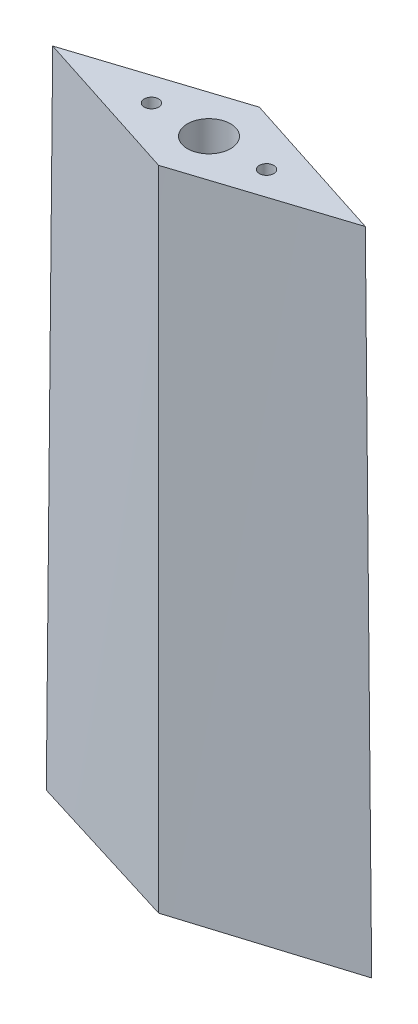
ISO-10303-21;
HEADER;
FILE_DESCRIPTION(('STEP AP214'),'2;1');
FILE_NAME('part.step','',(''),(''),'','','');
FILE_SCHEMA(('AUTOMOTIVE_DESIGN { 1 0 10303 214 1 1 1 1 }'));
ENDSEC;
DATA;
#1=APPLICATION_CONTEXT('core data for automotive mechanical design processes');
#2=APPLICATION_PROTOCOL_DEFINITION('international standard','automotive_design',2000,#1);
#3=PRODUCT_CONTEXT('',#1,'mechanical');
#4=PRODUCT('Part','Part','',(#3));
#5=PRODUCT_RELATED_PRODUCT_CATEGORY('part','',(#4));
#6=PRODUCT_DEFINITION_FORMATION('','',#4);
#7=PRODUCT_DEFINITION_CONTEXT('part definition',#1,'design');
#8=PRODUCT_DEFINITION('design','',#6,#7);
#9=PRODUCT_DEFINITION_SHAPE('','',#8);
#10=(LENGTH_UNIT() NAMED_UNIT(*) SI_UNIT(.MILLI.,.METRE.));
#11=(NAMED_UNIT(*) PLANE_ANGLE_UNIT() SI_UNIT($,.RADIAN.));
#12=(NAMED_UNIT(*) SI_UNIT($,.STERADIAN.) SOLID_ANGLE_UNIT());
#13=UNCERTAINTY_MEASURE_WITH_UNIT(LENGTH_MEASURE(1.E-05),#10,'distance_accuracy_value','');
#14=(GEOMETRIC_REPRESENTATION_CONTEXT(3) GLOBAL_UNCERTAINTY_ASSIGNED_CONTEXT((#13)) GLOBAL_UNIT_ASSIGNED_CONTEXT((#10,
#11,#12)) REPRESENTATION_CONTEXT('',''));
#15=CARTESIAN_POINT('',(0.,0.,0.));
#16=DIRECTION('',(0.,0.,1.));
#17=DIRECTION('',(1.,0.,0.));
#18=AXIS2_PLACEMENT_3D('',#15,#16,#17);
#19=CARTESIAN_POINT('',(219.716026671538,465.168027231046,0.));
#20=CARTESIAN_POINT('',(213.502471629307,1096.96763455169,0.));
#21=CARTESIAN_POINT('',(213.274793673085,465.168027231046,1.85208333333331));
#22=CARTESIAN_POINT('',(208.096831137892,1096.96763455169,1.85208333333331));
#23=CARTESIAN_POINT('',(206.833560674631,465.168027231046,3.70416666666664));
#24=CARTESIAN_POINT('',(202.691190646477,1096.96763455169,3.70416666666663));
#25=CARTESIAN_POINT('',(193.951094677724,465.168027231046,7.4083333333333));
#26=CARTESIAN_POINT('',(191.879909663647,1096.96763455169,7.4083333333333));
#27=CARTESIAN_POINT('',(187.509861679271,465.168027231046,9.26041666666665));
#28=CARTESIAN_POINT('',(186.474269172232,1096.96763455169,9.26041666666665));
#29=CARTESIAN_POINT('',(181.068628680817,465.168027231046,11.1125));
#30=CARTESIAN_POINT('',(181.068628680817,1096.96763455169,11.1125));
#31=B_SPLINE_SURFACE_WITH_KNOTS('',3,1,((#19,#20),(#21,#22),(#23,#24),(#25,#26),(#27,#28),(#29,
#30)),.UNSPECIFIED.,.F.,.F.,.F.,(4,2,4),(2,2),(0.,0.5,1.),(0.,1.),.UNSPECIFIED.);
#32=DIRECTION('',(0.,1.,0.));
#33=VECTOR('',#32,1.);
#34=CARTESIAN_POINT('',(181.068628680817,781.067830891368,11.1125));
#35=LINE('',#34,#33);
#36=CARTESIAN_POINT('',(181.068628680817,745.712215652406,11.1125));
#37=VERTEX_POINT('',#36);
#38=CARTESIAN_POINT('',(181.068628680817,888.587215652406,11.1125));
#39=VERTEX_POINT('',#38);
#40=EDGE_CURVE('E68',#37,#39,#35,.T.);
#41=CARTESIAN_POINT('',(181.068628680817,745.712215652406,11.1125));
#42=CARTESIAN_POINT('',(184.269788718265,745.712215652406,10.1212895187487));
#43=CARTESIAN_POINT('',(187.470948755713,745.712215652406,9.13007903749738));
#44=CARTESIAN_POINT('',(193.873268830608,745.712215652406,7.14765807499477));
#45=CARTESIAN_POINT('',(197.074428868056,745.712215652406,6.15644759374346));
#46=CARTESIAN_POINT('',(205.836046191891,745.712215652406,3.44349140832811));
#47=CARTESIAN_POINT('',(211.396503478278,745.712215652406,1.72174570416407));
#48=CARTESIAN_POINT('',(216.956960764665,745.712215652406,0.));
#49=B_SPLINE_CURVE_WITH_KNOTS('',3,(#41,#42,#43,#44,#45,#46,#47,#48),.UNSPECIFIED.,.F.,.F.,(4,2,
2,4),(0.,10.0533235415682,20.1066470831364,37.5694029232634),.UNSPECIFIED.);
#50=CARTESIAN_POINT('',(216.956960764665,745.712215652406,0.));
#51=VERTEX_POINT('',#50);
#52=EDGE_CURVE('E142',#37,#51,#49,.T.);
#53=DIRECTION('',(-0.00983421721197636,0.99995164291671,0.));
#54=VECTOR('',#53,1.);
#55=CARTESIAN_POINT('',(219.716026671538,465.168027231046,0.));
#56=LINE('',#55,#54);
#57=CARTESIAN_POINT('',(215.551829032432,888.587215652406,0.));
#58=VERTEX_POINT('',#57);
#59=EDGE_CURVE('E12',#51,#58,#56,.T.);
#60=CARTESIAN_POINT('',(215.551829032432,888.587215652406,0.));
#61=CARTESIAN_POINT('',(212.362250617464,888.587215652406,1.02786834675771));
#62=CARTESIAN_POINT('',(209.172672202496,888.587215652406,2.05573669351542));
#63=CARTESIAN_POINT('',(202.793515372561,888.587215652406,4.11147338703085));
#64=CARTESIAN_POINT('',(199.603936957593,888.587215652406,5.13934173378856));
#65=CARTESIAN_POINT('',(191.299115255356,888.587215652406,7.81564005369751));
#66=CARTESIAN_POINT('',(186.183871968087,888.587215652406,9.46407002684876));
#67=CARTESIAN_POINT('',(181.068628680817,888.587215652406,11.1125));
#68=B_SPLINE_CURVE_WITH_KNOTS('',3,(#60,#61,#62,#63,#64,#65,#66,#67),.UNSPECIFIED.,.F.,.F.,(4,2,
2,4),(0.,10.0533235415682,20.1066470831363,36.2295288782446),.UNSPECIFIED.);
#69=EDGE_CURVE('E120',#58,#39,#68,.T.);
#70=ORIENTED_EDGE('',*,*,#40,.F.);
#71=ORIENTED_EDGE('',*,*,#52,.T.);
#72=ORIENTED_EDGE('',*,*,#59,.T.);
#73=ORIENTED_EDGE('',*,*,#69,.T.);
#74=EDGE_LOOP('',(#70,#71,#72,#73));
#75=FACE_BOUND('',#74,.T.);
#76=ADVANCED_FACE('F61',(#75),#31,.F.);
#77=CARTESIAN_POINT('',(181.068628680817,465.168027231046,11.1125));
#78=CARTESIAN_POINT('',(181.068628680817,1096.96763455169,11.1125));
#79=CARTESIAN_POINT('',(174.627395682364,465.168027231046,9.26041666666668));
#80=CARTESIAN_POINT('',(175.662988189402,1096.96763455169,9.26041666666663));
#81=CARTESIAN_POINT('',(168.186162683911,465.168027231046,7.40833333333335));
#82=CARTESIAN_POINT('',(170.257347697988,1096.96763455169,7.40833333333328));
#83=CARTESIAN_POINT('',(155.303696687004,465.168027231046,3.70416666666668));
#84=CARTESIAN_POINT('',(159.446066715158,1096.96763455169,3.70416666666661));
#85=CARTESIAN_POINT('',(148.86246368855,465.168027231046,1.85208333333334));
#86=CARTESIAN_POINT('',(154.040426223743,1096.96763455169,1.8520833333333));
#87=CARTESIAN_POINT('',(142.421230690097,465.168027231046,0.));
#88=CARTESIAN_POINT('',(148.634785732328,1096.96763455169,0.));
#89=B_SPLINE_SURFACE_WITH_KNOTS('',3,1,((#77,#78),(#79,#80),(#81,#82),(#83,#84),(#85,#86),(#87,
#88)),.UNSPECIFIED.,.F.,.F.,.F.,(4,2,4),(2,2),(0.,0.5,1.),(0.,1.),.UNSPECIFIED.);
#90=DIRECTION('',(0.00983421721197636,0.99995164291671,0.));
#91=VECTOR('',#90,1.);
#92=CARTESIAN_POINT('',(145.528008211213,781.067830891368,0.));
#93=LINE('',#92,#91);
#94=CARTESIAN_POINT('',(145.18029659697,745.712215652406,0.));
#95=VERTEX_POINT('',#94);
#96=CARTESIAN_POINT('',(146.585428329203,888.587215652406,0.));
#97=VERTEX_POINT('',#96);
#98=EDGE_CURVE('E119',#95,#97,#93,.T.);
#99=CARTESIAN_POINT('',(145.18029659697,745.712215652406,0.));
#100=CARTESIAN_POINT('',(148.381456634418,745.712215652406,0.991210481251291));
#101=CARTESIAN_POINT('',(151.582616671865,745.712215652406,1.98242096250259));
#102=CARTESIAN_POINT('',(157.984936746761,745.712215652406,3.96484192500519));
#103=CARTESIAN_POINT('',(161.186096784208,745.712215652406,4.95605240625649));
#104=CARTESIAN_POINT('',(169.947714108043,745.712215652406,7.66900859167186));
#105=CARTESIAN_POINT('',(175.50817139443,745.712215652406,9.39075429583593));
#106=CARTESIAN_POINT('',(181.068628680817,745.712215652406,11.1125));
#107=B_SPLINE_CURVE_WITH_KNOTS('',3,(#99,#100,#101,#102,#103,#104,#105,#106),.UNSPECIFIED.,.F.,
.F.,(4,2,2,4),(0.,10.0533235415681,20.1066470831362,37.5694029232634),.UNSPECIFIED.);
#108=EDGE_CURVE('E80',#95,#37,#107,.T.);
#109=CARTESIAN_POINT('',(181.068628680817,888.587215652406,11.1125));
#110=CARTESIAN_POINT('',(177.87905026585,888.587215652406,10.0846316532423));
#111=CARTESIAN_POINT('',(174.689471850882,888.587215652406,9.05676330648458));
#112=CARTESIAN_POINT('',(168.310315020947,888.587215652406,7.00102661296915));
#113=CARTESIAN_POINT('',(165.120736605979,888.587215652406,5.97315826621144));
#114=CARTESIAN_POINT('',(156.815914903742,888.587215652406,3.29685994630247));
#115=CARTESIAN_POINT('',(151.700671616473,888.587215652406,1.64842997315123));
#116=CARTESIAN_POINT('',(146.585428329203,888.587215652406,0.));
#117=B_SPLINE_CURVE_WITH_KNOTS('',3,(#109,#110,#111,#112,#113,#114,#115,#116),.UNSPECIFIED.,.F.,
.F.,(4,2,2,4),(0.,10.0533235415682,20.1066470831363,36.2295288782446),.UNSPECIFIED.);
#118=EDGE_CURVE('E124',#39,#97,#117,.T.);
#119=ORIENTED_EDGE('',*,*,#98,.F.);
#120=ORIENTED_EDGE('',*,*,#108,.T.);
#121=ORIENTED_EDGE('',*,*,#40,.T.);
#122=ORIENTED_EDGE('',*,*,#118,.T.);
#123=EDGE_LOOP('',(#119,#120,#121,#122));
#124=FACE_BOUND('',#123,.T.);
#125=ADVANCED_FACE('F63',(#124),#89,.F.);
#126=CARTESIAN_POINT('',(219.716026671538,465.168027231046,0.));
#127=CARTESIAN_POINT('',(213.502471629307,1096.96763455169,0.));
#128=CARTESIAN_POINT('',(213.274793673085,465.168027231046,-1.85208333333331));
#129=CARTESIAN_POINT('',(208.096831137892,1096.96763455169,-1.85208333333331));
#130=CARTESIAN_POINT('',(206.833560674631,465.168027231046,-3.70416666666664));
#131=CARTESIAN_POINT('',(202.691190646477,1096.96763455169,-3.70416666666663));
#132=CARTESIAN_POINT('',(193.951094677724,465.168027231046,-7.4083333333333));
#133=CARTESIAN_POINT('',(191.879909663647,1096.96763455169,-7.4083333333333));
#134=CARTESIAN_POINT('',(187.509861679271,465.168027231046,-9.26041666666665));
#135=CARTESIAN_POINT('',(186.474269172232,1096.96763455169,-9.26041666666665));
#136=CARTESIAN_POINT('',(181.068628680817,465.168027231046,-11.1125));
#137=CARTESIAN_POINT('',(181.068628680817,1096.96763455169,-11.1125));
#138=B_SPLINE_SURFACE_WITH_KNOTS('',3,1,((#126,#127),(#128,#129),(#130,#131),(#132,#133),(#134,
#135),(#136,#137)),.UNSPECIFIED.,.F.,.F.,.F.,(4,2,4),(2,2),(0.,0.5,1.),(0.,1.),.UNSPECIFIED.);
#139=CARTESIAN_POINT('',(216.956960764665,745.712215652406,0.));
#140=CARTESIAN_POINT('',(213.755800727217,745.712215652406,-0.991210481251306));
#141=CARTESIAN_POINT('',(210.55464068977,745.712215652406,-1.98242096250261));
#142=CARTESIAN_POINT('',(204.152320614874,745.712215652406,-3.96484192500523));
#143=CARTESIAN_POINT('',(200.951160577427,745.712215652406,-4.95605240625653));
#144=CARTESIAN_POINT('',(192.189543253592,745.712215652406,-7.6690085916719));
#145=CARTESIAN_POINT('',(186.629085967205,745.712215652406,-9.39075429583595));
#146=CARTESIAN_POINT('',(181.068628680817,745.712215652406,-11.1125));
#147=B_SPLINE_CURVE_WITH_KNOTS('',3,(#139,#140,#141,#142,#143,#144,#145,#146),.UNSPECIFIED.,.F.,
.F.,(4,2,2,4),(0.,10.0533235415682,20.1066470831364,37.5694029232635),.UNSPECIFIED.);
#148=CARTESIAN_POINT('',(181.068628680817,745.712215652406,-11.1125));
#149=VERTEX_POINT('',#148);
#150=EDGE_CURVE('E106',#51,#149,#147,.T.);
#151=DIRECTION('',(0.,1.,0.));
#152=VECTOR('',#151,1.);
#153=CARTESIAN_POINT('',(181.068628680817,781.067830891368,-11.1125));
#154=LINE('',#153,#152);
#155=CARTESIAN_POINT('',(181.068628680817,888.587215652406,-11.1125));
#156=VERTEX_POINT('',#155);
#157=EDGE_CURVE('E88',#149,#156,#154,.T.);
#158=CARTESIAN_POINT('',(181.068628680817,888.587215652406,-11.1125));
#159=CARTESIAN_POINT('',(184.258207095785,888.587215652406,-10.0846316532423));
#160=CARTESIAN_POINT('',(187.447785510753,888.587215652406,-9.05676330648458));
#161=CARTESIAN_POINT('',(193.826942340688,888.587215652406,-7.00102661296915));
#162=CARTESIAN_POINT('',(197.016520755656,888.587215652406,-5.97315826621143));
#163=CARTESIAN_POINT('',(205.321342457893,888.587215652406,-3.29685994630248));
#164=CARTESIAN_POINT('',(210.436585745162,888.587215652406,-1.64842997315124));
#165=CARTESIAN_POINT('',(215.551829032432,888.587215652406,0.));
#166=B_SPLINE_CURVE_WITH_KNOTS('',3,(#158,#159,#160,#161,#162,#163,#164,#165),.UNSPECIFIED.,.F.,
.F.,(4,2,2,4),(0.,10.0533235415682,20.1066470831364,36.2295288782446),.UNSPECIFIED.);
#167=EDGE_CURVE('E215',#156,#58,#166,.T.);
#168=ORIENTED_EDGE('',*,*,#59,.F.);
#169=ORIENTED_EDGE('',*,*,#150,.T.);
#170=ORIENTED_EDGE('',*,*,#157,.T.);
#171=ORIENTED_EDGE('',*,*,#167,.T.);
#172=EDGE_LOOP('',(#168,#169,#170,#171));
#173=FACE_BOUND('',#172,.T.);
#174=ADVANCED_FACE('F113',(#173),#138,.T.);
#175=CARTESIAN_POINT('',(181.068628680817,465.168027231046,-11.1125));
#176=CARTESIAN_POINT('',(181.068628680817,1096.96763455169,-11.1125));
#177=CARTESIAN_POINT('',(174.627395682364,465.168027231046,-9.26041666666668));
#178=CARTESIAN_POINT('',(175.662988189402,1096.96763455169,-9.26041666666663));
#179=CARTESIAN_POINT('',(168.186162683911,465.168027231046,-7.40833333333335));
#180=CARTESIAN_POINT('',(170.257347697988,1096.96763455169,-7.40833333333328));
#181=CARTESIAN_POINT('',(155.303696687004,465.168027231046,-3.70416666666668));
#182=CARTESIAN_POINT('',(159.446066715158,1096.96763455169,-3.70416666666661));
#183=CARTESIAN_POINT('',(148.86246368855,465.168027231046,-1.85208333333334));
#184=CARTESIAN_POINT('',(154.040426223743,1096.96763455169,-1.8520833333333));
#185=CARTESIAN_POINT('',(142.421230690097,465.168027231046,0.));
#186=CARTESIAN_POINT('',(148.634785732328,1096.96763455169,0.));
#187=B_SPLINE_SURFACE_WITH_KNOTS('',3,1,((#175,#176),(#177,#178),(#179,#180),(#181,#182),(#183,
#184),(#185,#186)),.UNSPECIFIED.,.F.,.F.,.F.,(4,2,4),(2,2),(0.,0.5,1.),(0.,1.),.UNSPECIFIED.);
#188=CARTESIAN_POINT('',(181.068628680817,745.712215652406,-11.1125));
#189=CARTESIAN_POINT('',(177.86746864337,745.712215652406,-10.1212895187487));
#190=CARTESIAN_POINT('',(174.666308605922,745.712215652406,-9.13007903749739));
#191=CARTESIAN_POINT('',(168.263988531027,745.712215652406,-7.14765807499479));
#192=CARTESIAN_POINT('',(165.062828493579,745.712215652406,-6.15644759374348));
#193=CARTESIAN_POINT('',(156.301211169744,745.712215652406,-3.44349140832812));
#194=CARTESIAN_POINT('',(150.740753883357,745.712215652406,-1.72174570416406));
#195=CARTESIAN_POINT('',(145.18029659697,745.712215652406,0.));
#196=B_SPLINE_CURVE_WITH_KNOTS('',3,(#188,#189,#190,#191,#192,#193,#194,#195),.UNSPECIFIED.,.F.,
.F.,(4,2,2,4),(0.,10.0533235415681,20.1066470831363,37.5694029232634),.UNSPECIFIED.);
#197=EDGE_CURVE('E104',#149,#95,#196,.T.);
#198=CARTESIAN_POINT('',(146.585428329203,888.587215652406,0.));
#199=CARTESIAN_POINT('',(149.775006744171,888.587215652406,-1.0278683467577));
#200=CARTESIAN_POINT('',(152.964585159139,888.587215652406,-2.05573669351541));
#201=CARTESIAN_POINT('',(159.343741989074,888.587215652406,-4.11147338703084));
#202=CARTESIAN_POINT('',(162.533320404042,888.587215652406,-5.13934173378856));
#203=CARTESIAN_POINT('',(170.838142106279,888.587215652406,-7.81564005369752));
#204=CARTESIAN_POINT('',(175.953385393548,888.587215652406,-9.46407002684877));
#205=CARTESIAN_POINT('',(181.068628680817,888.587215652406,-11.1125));
#206=B_SPLINE_CURVE_WITH_KNOTS('',3,(#198,#199,#200,#201,#202,#203,#204,#205),.UNSPECIFIED.,.F.,
.F.,(4,2,2,4),(0.,10.0533235415682,20.1066470831363,36.2295288782446),.UNSPECIFIED.);
#207=EDGE_CURVE('E118',#97,#156,#206,.T.);
#208=ORIENTED_EDGE('',*,*,#157,.F.);
#209=ORIENTED_EDGE('',*,*,#197,.T.);
#210=ORIENTED_EDGE('',*,*,#98,.T.);
#211=ORIENTED_EDGE('',*,*,#207,.T.);
#212=EDGE_LOOP('',(#208,#209,#210,#211));
#213=FACE_BOUND('',#212,.T.);
#214=ADVANCED_FACE('F116',(#213),#187,.T.);
#215=CARTESIAN_POINT('',(181.068628680817,1100.16802723105,0.));
#216=DIRECTION('',(0.,-1.,0.));
#217=DIRECTION('',(0.,0.,-1.));
#218=AXIS2_PLACEMENT_3D('',#215,#216,#217);
#219=CYLINDRICAL_SURFACE('',#218,4.76250000000001);
#220=CARTESIAN_POINT('',(181.068628680817,745.712215652406,0.));
#221=DIRECTION('',(0.,1.,0.));
#222=DIRECTION('',(0.,0.,1.));
#223=AXIS2_PLACEMENT_3D('',#220,#221,#222);
#224=CIRCLE('',#223,4.76250000000001);
#225=CARTESIAN_POINT('',(181.068628680817,745.712215652406,-4.76250000000001));
#226=VERTEX_POINT('',#225);
#227=EDGE_CURVE('E110',#226,#226,#224,.F.);
#228=CARTESIAN_POINT('',(181.068628680817,888.587215652406,0.));
#229=DIRECTION('',(0.,-1.,0.));
#230=DIRECTION('',(0.,0.,-1.));
#231=AXIS2_PLACEMENT_3D('',#228,#229,#230);
#232=CIRCLE('',#231,4.76250000000001);
#233=CARTESIAN_POINT('',(181.068628680817,888.587215652406,-4.76250000000001));
#234=VERTEX_POINT('',#233);
#235=EDGE_CURVE('E140',#234,#234,#232,.F.);
#236=CARTESIAN_POINT('',(181.068628680817,745.712215652406,-4.76250000000001));
#237=CARTESIAN_POINT('',(181.068628680817,747.200496902406,-4.76250000000001));
#238=CARTESIAN_POINT('',(181.068628680817,748.688778152406,-4.76250000000001));
#239=CARTESIAN_POINT('',(181.068628680817,751.665340652406,-4.76250000000001));
#240=CARTESIAN_POINT('',(181.068628680817,753.153621902406,-4.76250000000001));
#241=CARTESIAN_POINT('',(181.068628680817,756.130184402406,-4.76250000000001));
#242=CARTESIAN_POINT('',(181.068628680817,757.618465652406,-4.76250000000001));
#243=CARTESIAN_POINT('',(181.068628680817,760.595028152406,-4.76250000000001));
#244=CARTESIAN_POINT('',(181.068628680817,762.083309402406,-4.76250000000001));
#245=CARTESIAN_POINT('',(181.068628680817,765.059871902406,-4.76250000000001));
#246=CARTESIAN_POINT('',(181.068628680817,766.548153152406,-4.76250000000001));
#247=CARTESIAN_POINT('',(181.068628680817,769.524715652406,-4.76250000000001));
#248=CARTESIAN_POINT('',(181.068628680817,771.012996902406,-4.76250000000001));
#249=CARTESIAN_POINT('',(181.068628680817,773.989559402406,-4.76250000000001));
#250=CARTESIAN_POINT('',(181.068628680817,775.477840652406,-4.76250000000001));
#251=CARTESIAN_POINT('',(181.068628680817,778.454403152406,-4.76250000000001));
#252=CARTESIAN_POINT('',(181.068628680817,779.942684402406,-4.76250000000001));
#253=CARTESIAN_POINT('',(181.068628680817,782.919246902406,-4.76250000000001));
#254=CARTESIAN_POINT('',(181.068628680817,784.407528152406,-4.76250000000001));
#255=CARTESIAN_POINT('',(181.068628680817,787.384090652406,-4.76250000000001));
#256=CARTESIAN_POINT('',(181.068628680817,788.872371902406,-4.76250000000001));
#257=CARTESIAN_POINT('',(181.068628680817,791.848934402406,-4.76250000000001));
#258=CARTESIAN_POINT('',(181.068628680817,793.337215652406,-4.76250000000001));
#259=CARTESIAN_POINT('',(181.068628680817,796.313778152406,-4.76250000000001));
#260=CARTESIAN_POINT('',(181.068628680817,797.802059402406,-4.76250000000001));
#261=CARTESIAN_POINT('',(181.068628680817,800.778621902406,-4.76250000000001));
#262=CARTESIAN_POINT('',(181.068628680817,802.266903152406,-4.76250000000001));
#263=CARTESIAN_POINT('',(181.068628680817,805.243465652406,-4.76250000000001));
#264=CARTESIAN_POINT('',(181.068628680817,806.731746902406,-4.76250000000001));
#265=CARTESIAN_POINT('',(181.068628680817,809.708309402406,-4.76250000000001));
#266=CARTESIAN_POINT('',(181.068628680817,811.196590652406,-4.76250000000001));
#267=CARTESIAN_POINT('',(181.068628680817,814.173153152406,-4.76250000000001));
#268=CARTESIAN_POINT('',(181.068628680817,815.661434402406,-4.76250000000001));
#269=CARTESIAN_POINT('',(181.068628680817,818.637996902406,-4.76250000000001));
#270=CARTESIAN_POINT('',(181.068628680817,820.126278152406,-4.76250000000001));
#271=CARTESIAN_POINT('',(181.068628680817,823.102840652406,-4.76250000000001));
#272=CARTESIAN_POINT('',(181.068628680817,824.591121902406,-4.76250000000001));
#273=CARTESIAN_POINT('',(181.068628680817,827.567684402406,-4.76250000000001));
#274=CARTESIAN_POINT('',(181.068628680817,829.055965652406,-4.76250000000001));
#275=CARTESIAN_POINT('',(181.068628680817,832.032528152406,-4.76250000000001));
#276=CARTESIAN_POINT('',(181.068628680817,833.520809402406,-4.76250000000001));
#277=CARTESIAN_POINT('',(181.068628680817,836.497371902406,-4.76250000000001));
#278=CARTESIAN_POINT('',(181.068628680817,837.985653152406,-4.76250000000001));
#279=CARTESIAN_POINT('',(181.068628680817,840.962215652406,-4.76250000000001));
#280=CARTESIAN_POINT('',(181.068628680817,842.450496902406,-4.76250000000001));
#281=CARTESIAN_POINT('',(181.068628680817,845.427059402406,-4.76250000000001));
#282=CARTESIAN_POINT('',(181.068628680817,846.915340652406,-4.76250000000001));
#283=CARTESIAN_POINT('',(181.068628680817,849.891903152406,-4.76250000000001));
#284=CARTESIAN_POINT('',(181.068628680817,851.380184402406,-4.76250000000001));
#285=CARTESIAN_POINT('',(181.068628680817,854.356746902406,-4.76250000000001));
#286=CARTESIAN_POINT('',(181.068628680817,855.845028152406,-4.76250000000001));
#287=CARTESIAN_POINT('',(181.068628680817,858.821590652406,-4.76250000000001));
#288=CARTESIAN_POINT('',(181.068628680817,860.309871902406,-4.76250000000001));
#289=CARTESIAN_POINT('',(181.068628680817,863.286434402406,-4.76250000000001));
#290=CARTESIAN_POINT('',(181.068628680817,864.774715652406,-4.76250000000001));
#291=CARTESIAN_POINT('',(181.068628680817,867.751278152406,-4.76250000000001));
#292=CARTESIAN_POINT('',(181.068628680817,869.239559402406,-4.76250000000001));
#293=CARTESIAN_POINT('',(181.068628680817,872.216121902406,-4.76250000000001));
#294=CARTESIAN_POINT('',(181.068628680817,873.704403152406,-4.76250000000001));
#295=CARTESIAN_POINT('',(181.068628680817,876.680965652406,-4.76250000000001));
#296=CARTESIAN_POINT('',(181.068628680817,878.169246902406,-4.76250000000001));
#297=CARTESIAN_POINT('',(181.068628680817,881.145809402406,-4.76250000000001));
#298=CARTESIAN_POINT('',(181.068628680817,882.634090652406,-4.76250000000001));
#299=CARTESIAN_POINT('',(181.068628680817,885.610653152406,-4.76250000000001));
#300=CARTESIAN_POINT('',(181.068628680817,887.098934402406,-4.76250000000001));
#301=CARTESIAN_POINT('',(181.068628680817,888.587215652406,-4.76250000000001));
#302=B_SPLINE_CURVE_WITH_KNOTS('',3,(#236,#237,#238,#239,#240,#241,#242,#243,#244,#245,#246,
#247,#248,#249,#250,#251,#252,#253,#254,#255,#256,#257,#258,#259,#260,#261,#262,#263,#264,#265,
#266,#267,#268,#269,#270,#271,#272,#273,#274,#275,#276,#277,#278,#279,#280,#281,#282,#283,#284,
#285,#286,#287,#288,#289,#290,#291,#292,#293,#294,#295,#296,#297,#298,#299,#300,#301),
.UNSPECIFIED.,.F.,.F.,(4,2,2,2,2,2,2,2,2,2,2,2,2,2,2,2,2,2,2,2,2,2,2,2,2,2,2,2,2,2,2,2,4),(0.,
4.46484374999989,8.92968750000001,13.3945312499999,17.859375,22.3242187499999,26.7890625,
31.2539062499999,35.71875,40.1835937499999,44.6484375,49.1132812499999,53.578125,
58.0429687499999,62.5078125,66.9726562499999,71.4375,75.9023437499999,80.3671875,
84.8320312499999,89.2968750000001,93.7617187499999,98.2265625000001,102.69140625,107.15625,
111.62109375,116.0859375,120.55078125,125.015625,129.48046875,133.9453125,138.41015625,142.875),.UNSPECIFIED.);
#303=EDGE_CURVE('BSEAM226',#226,#234,#302,.T.);
#304=ORIENTED_EDGE('',*,*,#227,.T.);
#305=ORIENTED_EDGE('',*,*,#235,.T.);
#306=ORIENTED_EDGE('',*,*,#303,.T.);
#307=ORIENTED_EDGE('',*,*,#303,.F.);
#308=EDGE_LOOP('',(#304,#306,#305,#307));
#309=FACE_BOUND('',#308,.T.);
#310=ADVANCED_FACE('F226',(#309),#219,.F.);
#311=CARTESIAN_POINT('',(0.,888.587215652406,-11.1126));
#312=DIRECTION('',(0.,-1.,0.));
#313=DIRECTION('',(0.,0.,-1.));
#314=AXIS2_PLACEMENT_3D('',#311,#312,#313);
#315=PLANE('',#314);
#316=CARTESIAN_POINT('',(193.768628680817,888.587215652406,0.));
#317=DIRECTION('',(0.,1.,0.));
#318=DIRECTION('',(0.,0.,1.));
#319=AXIS2_PLACEMENT_3D('',#316,#317,#318);
#320=CIRCLE('',#319,1.58749999999999);
#321=CARTESIAN_POINT('',(193.768628680817,888.587215652406,1.58749999999999));
#322=VERTEX_POINT('',#321);
#323=EDGE_CURVE('E360',#322,#322,#320,.T.);
#324=ORIENTED_EDGE('',*,*,#323,.F.);
#325=EDGE_LOOP('',(#324));
#326=FACE_BOUND('',#325,.T.);
#327=CARTESIAN_POINT('',(168.368628680817,888.587215652406,0.));
#328=DIRECTION('',(0.,1.,0.));
#329=DIRECTION('',(0.,0.,1.));
#330=AXIS2_PLACEMENT_3D('',#327,#328,#329);
#331=CIRCLE('',#330,1.58749999999999);
#332=CARTESIAN_POINT('',(168.368628680817,888.587215652406,1.58749999999999));
#333=VERTEX_POINT('',#332);
#334=EDGE_CURVE('E359',#333,#333,#331,.T.);
#335=ORIENTED_EDGE('',*,*,#334,.F.);
#336=EDGE_LOOP('',(#335));
#337=FACE_BOUND('',#336,.T.);
#338=ORIENTED_EDGE('',*,*,#235,.F.);
#339=EDGE_LOOP('',(#338));
#340=FACE_BOUND('',#339,.T.);
#341=ORIENTED_EDGE('',*,*,#167,.F.);
#342=ORIENTED_EDGE('',*,*,#207,.F.);
#343=ORIENTED_EDGE('',*,*,#118,.F.);
#344=ORIENTED_EDGE('',*,*,#69,.F.);
#345=EDGE_LOOP('',(#341,#342,#343,#344));
#346=FACE_BOUND('',#345,.T.);
#347=ADVANCED_FACE('F175',(#326,#337,#340,#346),#315,.F.);
#348=CARTESIAN_POINT('',(0.,745.712215652406,-11.1126));
#349=DIRECTION('',(0.,1.,0.));
#350=DIRECTION('',(0.,0.,1.));
#351=AXIS2_PLACEMENT_3D('',#348,#349,#350);
#352=PLANE('',#351);
#353=CARTESIAN_POINT('',(193.768628680817,745.712215652406,0.));
#354=DIRECTION('',(0.,-1.,0.));
#355=DIRECTION('',(0.,0.,-1.));
#356=AXIS2_PLACEMENT_3D('',#353,#354,#355);
#357=CIRCLE('',#356,1.58749999999999);
#358=CARTESIAN_POINT('',(193.768628680817,745.712215652406,-1.58749999999999));
#359=VERTEX_POINT('',#358);
#360=EDGE_CURVE('E156',#359,#359,#357,.T.);
#361=ORIENTED_EDGE('',*,*,#360,.F.);
#362=EDGE_LOOP('',(#361));
#363=FACE_BOUND('',#362,.T.);
#364=CARTESIAN_POINT('',(168.368628680817,745.712215652406,0.));
#365=DIRECTION('',(0.,-1.,0.));
#366=DIRECTION('',(0.,0.,-1.));
#367=AXIS2_PLACEMENT_3D('',#364,#365,#366);
#368=CIRCLE('',#367,1.58749999999999);
#369=CARTESIAN_POINT('',(168.368628680817,745.712215652406,-1.58749999999999));
#370=VERTEX_POINT('',#369);
#371=EDGE_CURVE('E148',#370,#370,#368,.T.);
#372=ORIENTED_EDGE('',*,*,#371,.F.);
#373=EDGE_LOOP('',(#372));
#374=FACE_BOUND('',#373,.T.);
#375=ORIENTED_EDGE('',*,*,#227,.F.);
#376=EDGE_LOOP('',(#375));
#377=FACE_BOUND('',#376,.T.);
#378=ORIENTED_EDGE('',*,*,#108,.F.);
#379=ORIENTED_EDGE('',*,*,#197,.F.);
#380=ORIENTED_EDGE('',*,*,#150,.F.);
#381=ORIENTED_EDGE('',*,*,#52,.F.);
#382=EDGE_LOOP('',(#378,#379,#380,#381));
#383=FACE_BOUND('',#382,.T.);
#384=ADVANCED_FACE('F105',(#363,#374,#377,#383),#352,.F.);
#385=CARTESIAN_POINT('',(168.368628680817,758.412215652406,0.));
#386=DIRECTION('',(0.,-1.,0.));
#387=DIRECTION('',(0.,0.,-1.));
#388=AXIS2_PLACEMENT_3D('',#385,#386,#387);
#389=CYLINDRICAL_SURFACE('',#388,1.58749999999999);
#390=CARTESIAN_POINT('',(168.368628680817,758.412215652406,0.));
#391=DIRECTION('',(0.,-1.,0.));
#392=DIRECTION('',(0.,0.,-1.));
#393=AXIS2_PLACEMENT_3D('',#390,#391,#392);
#394=CIRCLE('',#393,1.58749999999999);
#395=CARTESIAN_POINT('',(168.368628680817,758.412215652406,-1.58749999999999));
#396=VERTEX_POINT('',#395);
#397=EDGE_CURVE('E144',#396,#396,#394,.T.);
#398=ORIENTED_EDGE('',*,*,#397,.F.);
#399=EDGE_LOOP('',(#398));
#400=FACE_BOUND('',#399,.T.);
#401=ORIENTED_EDGE('',*,*,#371,.T.);
#402=EDGE_LOOP('',(#401));
#403=FACE_BOUND('',#402,.T.);
#404=ADVANCED_FACE('F174',(#400,#403),#389,.F.);
#405=CARTESIAN_POINT('',(168.368628680817,758.412215652406,0.));
#406=DIRECTION('',(0.,-1.,0.));
#407=DIRECTION('',(0.,0.,-1.));
#408=AXIS2_PLACEMENT_3D('',#405,#406,#407);
#409=PLANE('',#408);
#410=ORIENTED_EDGE('',*,*,#397,.T.);
#411=EDGE_LOOP('',(#410));
#412=FACE_BOUND('',#411,.T.);
#413=ADVANCED_FACE('F286',(#412),#409,.T.);
#414=CARTESIAN_POINT('',(193.768628680817,758.412215652406,0.));
#415=DIRECTION('',(0.,-1.,0.));
#416=DIRECTION('',(0.,0.,-1.));
#417=AXIS2_PLACEMENT_3D('',#414,#415,#416);
#418=CYLINDRICAL_SURFACE('',#417,1.58749999999999);
#419=CARTESIAN_POINT('',(193.768628680817,758.412215652406,0.));
#420=DIRECTION('',(0.,-1.,0.));
#421=DIRECTION('',(0.,0.,-1.));
#422=AXIS2_PLACEMENT_3D('',#419,#420,#421);
#423=CIRCLE('',#422,1.58749999999999);
#424=CARTESIAN_POINT('',(193.768628680817,758.412215652406,-1.58749999999999));
#425=VERTEX_POINT('',#424);
#426=EDGE_CURVE('E153',#425,#425,#423,.T.);
#427=ORIENTED_EDGE('',*,*,#426,.F.);
#428=EDGE_LOOP('',(#427));
#429=FACE_BOUND('',#428,.T.);
#430=ORIENTED_EDGE('',*,*,#360,.T.);
#431=EDGE_LOOP('',(#430));
#432=FACE_BOUND('',#431,.T.);
#433=ADVANCED_FACE('F294',(#429,#432),#418,.F.);
#434=CARTESIAN_POINT('',(193.768628680817,758.412215652406,0.));
#435=DIRECTION('',(0.,-1.,0.));
#436=DIRECTION('',(0.,0.,-1.));
#437=AXIS2_PLACEMENT_3D('',#434,#435,#436);
#438=PLANE('',#437);
#439=ORIENTED_EDGE('',*,*,#426,.T.);
#440=EDGE_LOOP('',(#439));
#441=FACE_BOUND('',#440,.T.);
#442=ADVANCED_FACE('F301',(#441),#438,.T.);
#443=CARTESIAN_POINT('',(168.368628680817,875.887215652406,0.));
#444=DIRECTION('',(0.,1.,0.));
#445=DIRECTION('',(0.,0.,1.));
#446=AXIS2_PLACEMENT_3D('',#443,#444,#445);
#447=CYLINDRICAL_SURFACE('',#446,1.58749999999999);
#448=CARTESIAN_POINT('',(168.368628680817,875.887215652406,0.));
#449=DIRECTION('',(0.,1.,0.));
#450=DIRECTION('',(0.,0.,1.));
#451=AXIS2_PLACEMENT_3D('',#448,#449,#450);
#452=CIRCLE('',#451,1.58749999999999);
#453=CARTESIAN_POINT('',(168.368628680817,875.887215652406,1.58749999999999));
#454=VERTEX_POINT('',#453);
#455=EDGE_CURVE('E363',#454,#454,#452,.T.);
#456=ORIENTED_EDGE('',*,*,#455,.F.);
#457=EDGE_LOOP('',(#456));
#458=FACE_BOUND('',#457,.T.);
#459=ORIENTED_EDGE('',*,*,#334,.T.);
#460=EDGE_LOOP('',(#459));
#461=FACE_BOUND('',#460,.T.);
#462=ADVANCED_FACE('F309',(#458,#461),#447,.F.);
#463=CARTESIAN_POINT('',(168.368628680817,875.887215652406,0.));
#464=DIRECTION('',(0.,1.,0.));
#465=DIRECTION('',(0.,0.,1.));
#466=AXIS2_PLACEMENT_3D('',#463,#464,#465);
#467=PLANE('',#466);
#468=ORIENTED_EDGE('',*,*,#455,.T.);
#469=EDGE_LOOP('',(#468));
#470=FACE_BOUND('',#469,.T.);
#471=ADVANCED_FACE('F317',(#470),#467,.T.);
#472=CARTESIAN_POINT('',(193.768628680817,875.887215652406,0.));
#473=DIRECTION('',(0.,1.,0.));
#474=DIRECTION('',(0.,0.,1.));
#475=AXIS2_PLACEMENT_3D('',#472,#473,#474);
#476=CYLINDRICAL_SURFACE('',#475,1.58749999999999);
#477=CARTESIAN_POINT('',(193.768628680817,875.887215652406,0.));
#478=DIRECTION('',(0.,1.,0.));
#479=DIRECTION('',(0.,0.,1.));
#480=AXIS2_PLACEMENT_3D('',#477,#478,#479);
#481=CIRCLE('',#480,1.58749999999999);
#482=CARTESIAN_POINT('',(193.768628680817,875.887215652406,1.58749999999999));
#483=VERTEX_POINT('',#482);
#484=EDGE_CURVE('E358',#483,#483,#481,.T.);
#485=ORIENTED_EDGE('',*,*,#484,.F.);
#486=EDGE_LOOP('',(#485));
#487=FACE_BOUND('',#486,.T.);
#488=ORIENTED_EDGE('',*,*,#323,.T.);
#489=EDGE_LOOP('',(#488));
#490=FACE_BOUND('',#489,.T.);
#491=ADVANCED_FACE('F326',(#487,#490),#476,.F.);
#492=CARTESIAN_POINT('',(193.768628680817,875.887215652406,0.));
#493=DIRECTION('',(0.,1.,0.));
#494=DIRECTION('',(0.,0.,1.));
#495=AXIS2_PLACEMENT_3D('',#492,#493,#494);
#496=PLANE('',#495);
#497=ORIENTED_EDGE('',*,*,#484,.T.);
#498=EDGE_LOOP('',(#497));
#499=FACE_BOUND('',#498,.T.);
#500=ADVANCED_FACE('F335',(#499),#496,.T.);
#501=CLOSED_SHELL('',(#76,#125,#174,#214,#310,#347,#384,#404,#413,#433,#442,#462,#471,#491,#500));
#502=MANIFOLD_SOLID_BREP('B2',#501);
#503=ADVANCED_BREP_SHAPE_REPRESENTATION('',(#18,#502),#14);
#504=SHAPE_DEFINITION_REPRESENTATION(#9,#503);
ENDSEC;
END-ISO-10303-21;
